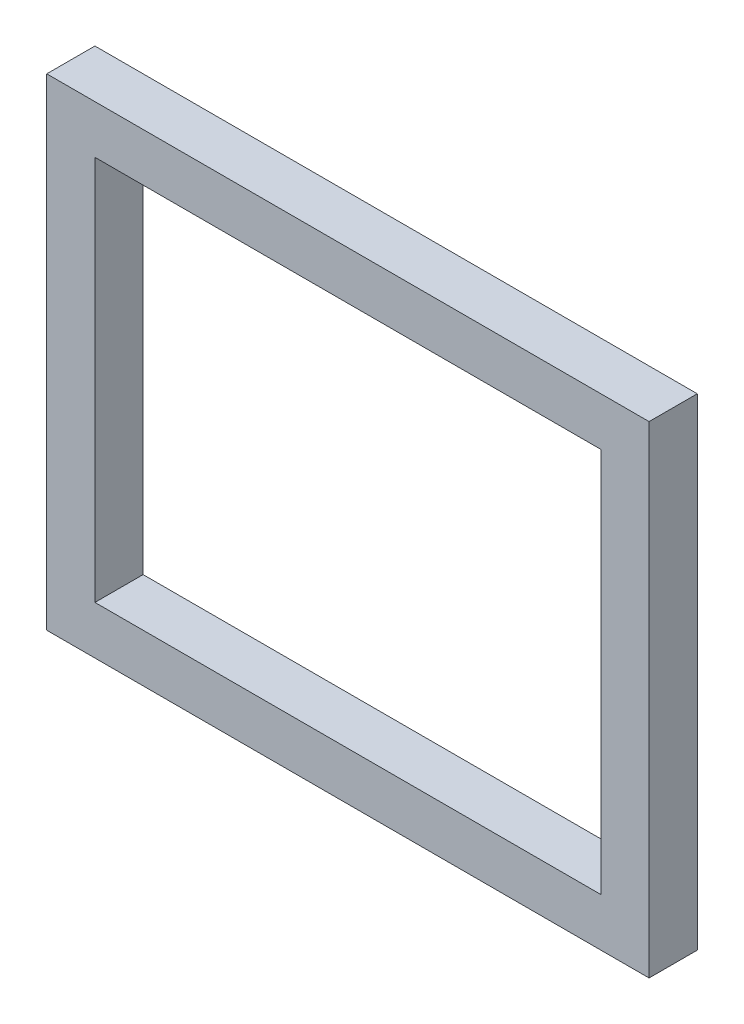
ISO-10303-21;
HEADER;
FILE_DESCRIPTION(('STEP AP214'),'2;1');
FILE_NAME('part.step','',(''),(''),'','','');
FILE_SCHEMA(('AUTOMOTIVE_DESIGN { 1 0 10303 214 1 1 1 1 }'));
ENDSEC;
DATA;
#1=APPLICATION_CONTEXT('core data for automotive mechanical design processes');
#2=APPLICATION_PROTOCOL_DEFINITION('international standard','automotive_design',2000,#1);
#3=PRODUCT_CONTEXT('',#1,'mechanical');
#4=PRODUCT('Part','Part','',(#3));
#5=PRODUCT_RELATED_PRODUCT_CATEGORY('part','',(#4));
#6=PRODUCT_DEFINITION_FORMATION('','',#4);
#7=PRODUCT_DEFINITION_CONTEXT('part definition',#1,'design');
#8=PRODUCT_DEFINITION('design','',#6,#7);
#9=PRODUCT_DEFINITION_SHAPE('','',#8);
#10=(LENGTH_UNIT() NAMED_UNIT(*) SI_UNIT(.MILLI.,.METRE.));
#11=(NAMED_UNIT(*) PLANE_ANGLE_UNIT() SI_UNIT($,.RADIAN.));
#12=(NAMED_UNIT(*) SI_UNIT($,.STERADIAN.) SOLID_ANGLE_UNIT());
#13=UNCERTAINTY_MEASURE_WITH_UNIT(LENGTH_MEASURE(1.E-05),#10,'distance_accuracy_value','');
#14=(GEOMETRIC_REPRESENTATION_CONTEXT(3) GLOBAL_UNCERTAINTY_ASSIGNED_CONTEXT((#13)) GLOBAL_UNIT_ASSIGNED_CONTEXT((#10,
#11,#12)) REPRESENTATION_CONTEXT('',''));
#15=CARTESIAN_POINT('',(0.,0.,0.));
#16=DIRECTION('',(0.,0.,1.));
#17=DIRECTION('',(1.,0.,0.));
#18=AXIS2_PLACEMENT_3D('',#15,#16,#17);
#19=CARTESIAN_POINT('',(125.,100.,20.));
#20=DIRECTION('',(-1.,0.,0.));
#21=DIRECTION('',(0.,0.,1.));
#22=AXIS2_PLACEMENT_3D('',#19,#20,#21);
#23=PLANE('',#22);
#24=DIRECTION('',(0.,1.,0.));
#25=VECTOR('',#24,1.);
#26=CARTESIAN_POINT('',(125.,100.,0.));
#27=LINE('',#26,#25);
#28=CARTESIAN_POINT('',(125.,-100.,0.));
#29=VERTEX_POINT('',#28);
#30=CARTESIAN_POINT('',(125.,100.,0.));
#31=VERTEX_POINT('',#30);
#32=EDGE_CURVE('E136',#29,#31,#27,.T.);
#33=ORIENTED_EDGE('',*,*,#32,.T.);
#34=DIRECTION('',(0.,0.,-1.));
#35=VECTOR('',#34,1.);
#36=CARTESIAN_POINT('',(125.,100.,20.));
#37=LINE('',#36,#35);
#38=CARTESIAN_POINT('',(125.,100.,20.));
#39=VERTEX_POINT('',#38);
#40=EDGE_CURVE('E11',#39,#31,#37,.T.);
#41=ORIENTED_EDGE('',*,*,#40,.F.);
#42=DIRECTION('',(0.,1.,0.));
#43=VECTOR('',#42,1.);
#44=CARTESIAN_POINT('',(125.,100.,20.));
#45=LINE('',#44,#43);
#46=CARTESIAN_POINT('',(125.,-100.,20.));
#47=VERTEX_POINT('',#46);
#48=EDGE_CURVE('E140',#47,#39,#45,.T.);
#49=ORIENTED_EDGE('',*,*,#48,.F.);
#50=DIRECTION('',(0.,0.,-1.));
#51=VECTOR('',#50,1.);
#52=CARTESIAN_POINT('',(125.,-100.,20.));
#53=LINE('',#52,#51);
#54=EDGE_CURVE('E150',#47,#29,#53,.T.);
#55=ORIENTED_EDGE('',*,*,#54,.T.);
#56=EDGE_LOOP('',(#33,#41,#49,#55));
#57=FACE_BOUND('',#56,.T.);
#58=ADVANCED_FACE('F39',(#57),#23,.F.);
#59=CARTESIAN_POINT('',(-125.,100.,20.));
#60=DIRECTION('',(0.,-1.,0.));
#61=DIRECTION('',(0.,0.,-1.));
#62=AXIS2_PLACEMENT_3D('',#59,#60,#61);
#63=PLANE('',#62);
#64=DIRECTION('',(-1.,0.,0.));
#65=VECTOR('',#64,1.);
#66=CARTESIAN_POINT('',(-125.,100.,0.));
#67=LINE('',#66,#65);
#68=CARTESIAN_POINT('',(-125.,100.,0.));
#69=VERTEX_POINT('',#68);
#70=EDGE_CURVE('E153',#31,#69,#67,.T.);
#71=ORIENTED_EDGE('',*,*,#70,.T.);
#72=DIRECTION('',(0.,0.,-1.));
#73=VECTOR('',#72,1.);
#74=CARTESIAN_POINT('',(-125.,100.,20.));
#75=LINE('',#74,#73);
#76=CARTESIAN_POINT('',(-125.,100.,20.));
#77=VERTEX_POINT('',#76);
#78=EDGE_CURVE('E46',#77,#69,#75,.T.);
#79=ORIENTED_EDGE('',*,*,#78,.F.);
#80=DIRECTION('',(-1.,0.,0.));
#81=VECTOR('',#80,1.);
#82=CARTESIAN_POINT('',(-125.,100.,20.));
#83=LINE('',#82,#81);
#84=EDGE_CURVE('E143',#39,#77,#83,.T.);
#85=ORIENTED_EDGE('',*,*,#84,.F.);
#86=ORIENTED_EDGE('',*,*,#40,.T.);
#87=EDGE_LOOP('',(#71,#79,#85,#86));
#88=FACE_BOUND('',#87,.T.);
#89=ADVANCED_FACE('F181',(#88),#63,.F.);
#90=CARTESIAN_POINT('',(-125.,100.,20.));
#91=DIRECTION('',(1.,0.,0.));
#92=DIRECTION('',(0.,1.,0.));
#93=AXIS2_PLACEMENT_3D('',#90,#91,#92);
#94=PLANE('',#93);
#95=DIRECTION('',(0.,-1.,0.));
#96=VECTOR('',#95,1.);
#97=CARTESIAN_POINT('',(-125.,100.,0.));
#98=LINE('',#97,#96);
#99=CARTESIAN_POINT('',(-125.,-100.,0.));
#100=VERTEX_POINT('',#99);
#101=EDGE_CURVE('E155',#69,#100,#98,.T.);
#102=ORIENTED_EDGE('',*,*,#101,.T.);
#103=DIRECTION('',(0.,0.,-1.));
#104=VECTOR('',#103,1.);
#105=CARTESIAN_POINT('',(-125.,-100.,20.));
#106=LINE('',#105,#104);
#107=CARTESIAN_POINT('',(-125.,-100.,20.));
#108=VERTEX_POINT('',#107);
#109=EDGE_CURVE('E160',#108,#100,#106,.T.);
#110=ORIENTED_EDGE('',*,*,#109,.F.);
#111=DIRECTION('',(0.,-1.,0.));
#112=VECTOR('',#111,1.);
#113=CARTESIAN_POINT('',(-125.,100.,20.));
#114=LINE('',#113,#112);
#115=EDGE_CURVE('E146',#77,#108,#114,.T.);
#116=ORIENTED_EDGE('',*,*,#115,.F.);
#117=ORIENTED_EDGE('',*,*,#78,.T.);
#118=EDGE_LOOP('',(#102,#110,#116,#117));
#119=FACE_BOUND('',#118,.T.);
#120=ADVANCED_FACE('F167',(#119),#94,.F.);
#121=CARTESIAN_POINT('',(125.,-100.,20.));
#122=DIRECTION('',(0.,1.,0.));
#123=DIRECTION('',(0.,0.,1.));
#124=AXIS2_PLACEMENT_3D('',#121,#122,#123);
#125=PLANE('',#124);
#126=DIRECTION('',(1.,0.,0.));
#127=VECTOR('',#126,1.);
#128=CARTESIAN_POINT('',(125.,-100.,0.));
#129=LINE('',#128,#127);
#130=EDGE_CURVE('E144',#100,#29,#129,.T.);
#131=ORIENTED_EDGE('',*,*,#130,.T.);
#132=ORIENTED_EDGE('',*,*,#54,.F.);
#133=DIRECTION('',(1.,0.,0.));
#134=VECTOR('',#133,1.);
#135=CARTESIAN_POINT('',(125.,-100.,20.));
#136=LINE('',#135,#134);
#137=EDGE_CURVE('E148',#108,#47,#136,.T.);
#138=ORIENTED_EDGE('',*,*,#137,.F.);
#139=ORIENTED_EDGE('',*,*,#109,.T.);
#140=EDGE_LOOP('',(#131,#132,#138,#139));
#141=FACE_BOUND('',#140,.T.);
#142=ADVANCED_FACE('F174',(#141),#125,.F.);
#143=CARTESIAN_POINT('',(0.,0.,20.));
#144=DIRECTION('',(0.,0.,-1.));
#145=DIRECTION('',(-1.,0.,0.));
#146=AXIS2_PLACEMENT_3D('',#143,#144,#145);
#147=PLANE('',#146);
#148=DIRECTION('',(-1.,0.,0.));
#149=VECTOR('',#148,1.);
#150=CARTESIAN_POINT('',(-105.,80.,20.));
#151=LINE('',#150,#149);
#152=CARTESIAN_POINT('',(105.,80.,20.));
#153=VERTEX_POINT('',#152);
#154=CARTESIAN_POINT('',(-105.,80.,20.));
#155=VERTEX_POINT('',#154);
#156=EDGE_CURVE('E130',#153,#155,#151,.T.);
#157=ORIENTED_EDGE('',*,*,#156,.F.);
#158=DIRECTION('',(0.,1.,0.));
#159=VECTOR('',#158,1.);
#160=CARTESIAN_POINT('',(105.,80.,20.));
#161=LINE('',#160,#159);
#162=CARTESIAN_POINT('',(105.,-80.,20.));
#163=VERTEX_POINT('',#162);
#164=EDGE_CURVE('E53',#163,#153,#161,.T.);
#165=ORIENTED_EDGE('',*,*,#164,.F.);
#166=DIRECTION('',(1.,0.,0.));
#167=VECTOR('',#166,1.);
#168=CARTESIAN_POINT('',(-105.,-80.,20.));
#169=LINE('',#168,#167);
#170=CARTESIAN_POINT('',(-105.,-80.,20.));
#171=VERTEX_POINT('',#170);
#172=EDGE_CURVE('E121',#171,#163,#169,.T.);
#173=ORIENTED_EDGE('',*,*,#172,.F.);
#174=DIRECTION('',(0.,-1.,0.));
#175=VECTOR('',#174,1.);
#176=CARTESIAN_POINT('',(-105.,80.,20.));
#177=LINE('',#176,#175);
#178=EDGE_CURVE('E124',#155,#171,#177,.T.);
#179=ORIENTED_EDGE('',*,*,#178,.F.);
#180=EDGE_LOOP('',(#157,#165,#173,#179));
#181=FACE_BOUND('',#180,.T.);
#182=ORIENTED_EDGE('',*,*,#48,.T.);
#183=ORIENTED_EDGE('',*,*,#84,.T.);
#184=ORIENTED_EDGE('',*,*,#115,.T.);
#185=ORIENTED_EDGE('',*,*,#137,.T.);
#186=EDGE_LOOP('',(#182,#183,#184,#185));
#187=FACE_BOUND('',#186,.T.);
#188=ADVANCED_FACE('F180',(#181,#187),#147,.F.);
#189=CARTESIAN_POINT('',(0.,0.,0.));
#190=DIRECTION('',(0.,0.,-1.));
#191=DIRECTION('',(-1.,0.,0.));
#192=AXIS2_PLACEMENT_3D('',#189,#190,#191);
#193=PLANE('',#192);
#194=DIRECTION('',(0.,1.,0.));
#195=VECTOR('',#194,1.);
#196=CARTESIAN_POINT('',(105.,80.,0.));
#197=LINE('',#196,#195);
#198=CARTESIAN_POINT('',(105.,-80.,0.));
#199=VERTEX_POINT('',#198);
#200=CARTESIAN_POINT('',(105.,80.,0.));
#201=VERTEX_POINT('',#200);
#202=EDGE_CURVE('E105',#199,#201,#197,.T.);
#203=ORIENTED_EDGE('',*,*,#202,.T.);
#204=DIRECTION('',(-1.,0.,0.));
#205=VECTOR('',#204,1.);
#206=CARTESIAN_POINT('',(-105.,80.,0.));
#207=LINE('',#206,#205);
#208=CARTESIAN_POINT('',(-105.,80.,0.));
#209=VERTEX_POINT('',#208);
#210=EDGE_CURVE('E114',#201,#209,#207,.T.);
#211=ORIENTED_EDGE('',*,*,#210,.T.);
#212=DIRECTION('',(0.,-1.,0.));
#213=VECTOR('',#212,1.);
#214=CARTESIAN_POINT('',(-105.,80.,0.));
#215=LINE('',#214,#213);
#216=CARTESIAN_POINT('',(-105.,-80.,0.));
#217=VERTEX_POINT('',#216);
#218=EDGE_CURVE('E61',#209,#217,#215,.T.);
#219=ORIENTED_EDGE('',*,*,#218,.T.);
#220=DIRECTION('',(1.,0.,0.));
#221=VECTOR('',#220,1.);
#222=CARTESIAN_POINT('',(-105.,-80.,0.));
#223=LINE('',#222,#221);
#224=EDGE_CURVE('E111',#217,#199,#223,.T.);
#225=ORIENTED_EDGE('',*,*,#224,.T.);
#226=EDGE_LOOP('',(#203,#211,#219,#225));
#227=FACE_BOUND('',#226,.T.);
#228=ORIENTED_EDGE('',*,*,#32,.F.);
#229=ORIENTED_EDGE('',*,*,#130,.F.);
#230=ORIENTED_EDGE('',*,*,#101,.F.);
#231=ORIENTED_EDGE('',*,*,#70,.F.);
#232=EDGE_LOOP('',(#228,#229,#230,#231));
#233=FACE_BOUND('',#232,.T.);
#234=ADVANCED_FACE('F118',(#227,#233),#193,.T.);
#235=CARTESIAN_POINT('',(105.,80.,0.));
#236=DIRECTION('',(1.,0.,0.));
#237=DIRECTION('',(0.,1.,0.));
#238=AXIS2_PLACEMENT_3D('',#235,#236,#237);
#239=PLANE('',#238);
#240=ORIENTED_EDGE('',*,*,#164,.T.);
#241=DIRECTION('',(0.,0.,1.));
#242=VECTOR('',#241,1.);
#243=CARTESIAN_POINT('',(105.,80.,0.));
#244=LINE('',#243,#242);
#245=EDGE_CURVE('E101',#201,#153,#244,.T.);
#246=ORIENTED_EDGE('',*,*,#245,.F.);
#247=ORIENTED_EDGE('',*,*,#202,.F.);
#248=DIRECTION('',(0.,0.,1.));
#249=VECTOR('',#248,1.);
#250=CARTESIAN_POINT('',(105.,-80.,0.));
#251=LINE('',#250,#249);
#252=EDGE_CURVE('E134',#199,#163,#251,.T.);
#253=ORIENTED_EDGE('',*,*,#252,.T.);
#254=EDGE_LOOP('',(#240,#246,#247,#253));
#255=FACE_BOUND('',#254,.T.);
#256=ADVANCED_FACE('F103',(#255),#239,.F.);
#257=CARTESIAN_POINT('',(-105.,-80.,0.));
#258=DIRECTION('',(0.,-1.,0.));
#259=DIRECTION('',(0.,0.,-1.));
#260=AXIS2_PLACEMENT_3D('',#257,#258,#259);
#261=PLANE('',#260);
#262=ORIENTED_EDGE('',*,*,#172,.T.);
#263=ORIENTED_EDGE('',*,*,#252,.F.);
#264=ORIENTED_EDGE('',*,*,#224,.F.);
#265=DIRECTION('',(0.,0.,1.));
#266=VECTOR('',#265,1.);
#267=CARTESIAN_POINT('',(-105.,-80.,0.));
#268=LINE('',#267,#266);
#269=EDGE_CURVE('E137',#217,#171,#268,.T.);
#270=ORIENTED_EDGE('',*,*,#269,.T.);
#271=EDGE_LOOP('',(#262,#263,#264,#270));
#272=FACE_BOUND('',#271,.T.);
#273=ADVANCED_FACE('F198',(#272),#261,.F.);
#274=CARTESIAN_POINT('',(-105.,80.,0.));
#275=DIRECTION('',(-1.,0.,0.));
#276=DIRECTION('',(0.,-1.,0.));
#277=AXIS2_PLACEMENT_3D('',#274,#275,#276);
#278=PLANE('',#277);
#279=ORIENTED_EDGE('',*,*,#178,.T.);
#280=ORIENTED_EDGE('',*,*,#269,.F.);
#281=ORIENTED_EDGE('',*,*,#218,.F.);
#282=DIRECTION('',(0.,0.,1.));
#283=VECTOR('',#282,1.);
#284=CARTESIAN_POINT('',(-105.,80.,0.));
#285=LINE('',#284,#283);
#286=EDGE_CURVE('E110',#209,#155,#285,.T.);
#287=ORIENTED_EDGE('',*,*,#286,.T.);
#288=EDGE_LOOP('',(#279,#280,#281,#287));
#289=FACE_BOUND('',#288,.T.);
#290=ADVANCED_FACE('F201',(#289),#278,.F.);
#291=CARTESIAN_POINT('',(-105.,80.,0.));
#292=DIRECTION('',(0.,1.,0.));
#293=DIRECTION('',(0.,0.,1.));
#294=AXIS2_PLACEMENT_3D('',#291,#292,#293);
#295=PLANE('',#294);
#296=ORIENTED_EDGE('',*,*,#156,.T.);
#297=ORIENTED_EDGE('',*,*,#286,.F.);
#298=ORIENTED_EDGE('',*,*,#210,.F.);
#299=ORIENTED_EDGE('',*,*,#245,.T.);
#300=EDGE_LOOP('',(#296,#297,#298,#299));
#301=FACE_BOUND('',#300,.T.);
#302=ADVANCED_FACE('F115',(#301),#295,.F.);
#303=CLOSED_SHELL('',(#58,#89,#120,#142,#188,#234,#256,#273,#290,#302));
#304=MANIFOLD_SOLID_BREP('B2',#303);
#305=ADVANCED_BREP_SHAPE_REPRESENTATION('',(#18,#304),#14);
#306=SHAPE_DEFINITION_REPRESENTATION(#9,#305);
ENDSEC;
END-ISO-10303-21;
